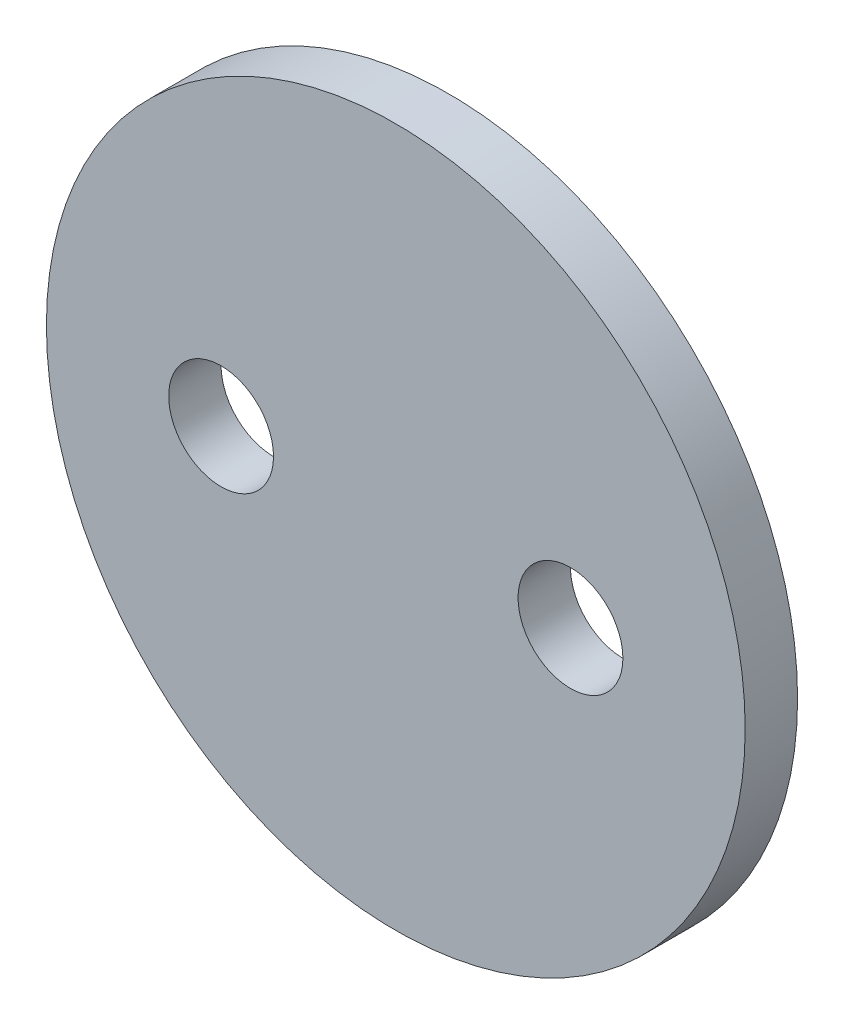
ISO-10303-21;
HEADER;
FILE_DESCRIPTION(('STEP AP214'),'2;1');
FILE_NAME('part.step','',(''),(''),'','','');
FILE_SCHEMA(('AUTOMOTIVE_DESIGN { 1 0 10303 214 1 1 1 1 }'));
ENDSEC;
DATA;
#1=APPLICATION_CONTEXT('core data for automotive mechanical design processes');
#2=APPLICATION_PROTOCOL_DEFINITION('international standard','automotive_design',2000,#1);
#3=PRODUCT_CONTEXT('',#1,'mechanical');
#4=PRODUCT('Part','Part','',(#3));
#5=PRODUCT_RELATED_PRODUCT_CATEGORY('part','',(#4));
#6=PRODUCT_DEFINITION_FORMATION('','',#4);
#7=PRODUCT_DEFINITION_CONTEXT('part definition',#1,'design');
#8=PRODUCT_DEFINITION('design','',#6,#7);
#9=PRODUCT_DEFINITION_SHAPE('','',#8);
#10=(LENGTH_UNIT() NAMED_UNIT(*) SI_UNIT(.MILLI.,.METRE.));
#11=(NAMED_UNIT(*) PLANE_ANGLE_UNIT() SI_UNIT($,.RADIAN.));
#12=(NAMED_UNIT(*) SI_UNIT($,.STERADIAN.) SOLID_ANGLE_UNIT());
#13=UNCERTAINTY_MEASURE_WITH_UNIT(LENGTH_MEASURE(1.E-05),#10,'distance_accuracy_value','');
#14=(GEOMETRIC_REPRESENTATION_CONTEXT(3) GLOBAL_UNCERTAINTY_ASSIGNED_CONTEXT((#13)) GLOBAL_UNIT_ASSIGNED_CONTEXT((#10,
#11,#12)) REPRESENTATION_CONTEXT('',''));
#15=CARTESIAN_POINT('',(0.,0.,0.));
#16=DIRECTION('',(0.,0.,1.));
#17=DIRECTION('',(1.,0.,0.));
#18=AXIS2_PLACEMENT_3D('',#15,#16,#17);
#19=CARTESIAN_POINT('',(0.,0.,1.5));
#20=DIRECTION('',(0.,0.,1.));
#21=DIRECTION('',(1.,0.,0.));
#22=AXIS2_PLACEMENT_3D('',#19,#20,#21);
#23=PLANE('',#22);
#24=CARTESIAN_POINT('',(-5.,0.,1.5));
#25=DIRECTION('',(0.,0.,1.));
#26=DIRECTION('',(1.,0.,0.));
#27=AXIS2_PLACEMENT_3D('',#24,#25,#26);
#28=CIRCLE('',#27,1.5);
#29=CARTESIAN_POINT('',(-3.5,0.,1.5));
#30=VERTEX_POINT('',#29);
#31=EDGE_CURVE('E50',#30,#30,#28,.T.);
#32=ORIENTED_EDGE('',*,*,#31,.F.);
#33=EDGE_LOOP('',(#32));
#34=FACE_BOUND('',#33,.T.);
#35=CARTESIAN_POINT('',(0.,0.,1.5));
#36=DIRECTION('',(0.,0.,1.));
#37=DIRECTION('',(1.,0.,0.));
#38=AXIS2_PLACEMENT_3D('',#35,#36,#37);
#39=CIRCLE('',#38,10.);
#40=CARTESIAN_POINT('',(10.,0.,1.5));
#41=VERTEX_POINT('',#40);
#42=EDGE_CURVE('E10',#41,#41,#39,.T.);
#43=ORIENTED_EDGE('',*,*,#42,.T.);
#44=EDGE_LOOP('',(#43));
#45=FACE_BOUND('',#44,.T.);
#46=CARTESIAN_POINT('',(5.,0.,1.5));
#47=DIRECTION('',(0.,0.,1.));
#48=DIRECTION('',(1.,0.,0.));
#49=AXIS2_PLACEMENT_3D('',#46,#47,#48);
#50=CIRCLE('',#49,1.5);
#51=CARTESIAN_POINT('',(6.5,0.,1.5));
#52=VERTEX_POINT('',#51);
#53=EDGE_CURVE('E56',#52,#52,#50,.T.);
#54=ORIENTED_EDGE('',*,*,#53,.F.);
#55=EDGE_LOOP('',(#54));
#56=FACE_BOUND('',#55,.T.);
#57=ADVANCED_FACE('F37',(#34,#45,#56),#23,.T.);
#58=CARTESIAN_POINT('',(0.,0.,0.));
#59=DIRECTION('',(0.,0.,1.));
#60=DIRECTION('',(1.,0.,0.));
#61=AXIS2_PLACEMENT_3D('',#58,#59,#60);
#62=PLANE('',#61);
#63=CARTESIAN_POINT('',(0.,0.,0.));
#64=DIRECTION('',(0.,0.,1.));
#65=DIRECTION('',(1.,0.,0.));
#66=AXIS2_PLACEMENT_3D('',#63,#64,#65);
#67=CIRCLE('',#66,10.);
#68=CARTESIAN_POINT('',(10.,0.,0.));
#69=VERTEX_POINT('',#68);
#70=EDGE_CURVE('E41',#69,#69,#67,.T.);
#71=ORIENTED_EDGE('',*,*,#70,.F.);
#72=EDGE_LOOP('',(#71));
#73=FACE_BOUND('',#72,.T.);
#74=CARTESIAN_POINT('',(-5.,0.,0.));
#75=DIRECTION('',(0.,0.,1.));
#76=DIRECTION('',(1.,0.,0.));
#77=AXIS2_PLACEMENT_3D('',#74,#75,#76);
#78=CIRCLE('',#77,1.5);
#79=CARTESIAN_POINT('',(-3.5,0.,0.));
#80=VERTEX_POINT('',#79);
#81=EDGE_CURVE('E52',#80,#80,#78,.T.);
#82=ORIENTED_EDGE('',*,*,#81,.T.);
#83=EDGE_LOOP('',(#82));
#84=FACE_BOUND('',#83,.T.);
#85=CARTESIAN_POINT('',(5.,0.,0.));
#86=DIRECTION('',(0.,0.,1.));
#87=DIRECTION('',(1.,0.,0.));
#88=AXIS2_PLACEMENT_3D('',#85,#86,#87);
#89=CIRCLE('',#88,1.5);
#90=CARTESIAN_POINT('',(6.5,0.,0.));
#91=VERTEX_POINT('',#90);
#92=EDGE_CURVE('E60',#91,#91,#89,.T.);
#93=ORIENTED_EDGE('',*,*,#92,.T.);
#94=EDGE_LOOP('',(#93));
#95=FACE_BOUND('',#94,.T.);
#96=ADVANCED_FACE('F72',(#73,#84,#95),#62,.F.);
#97=CARTESIAN_POINT('',(0.,0.,1.5));
#98=DIRECTION('',(0.,0.,-1.));
#99=DIRECTION('',(-1.,0.,0.));
#100=AXIS2_PLACEMENT_3D('',#97,#98,#99);
#101=CYLINDRICAL_SURFACE('',#100,10.);
#102=ORIENTED_EDGE('',*,*,#42,.F.);
#103=EDGE_LOOP('',(#102));
#104=FACE_BOUND('',#103,.T.);
#105=ORIENTED_EDGE('',*,*,#70,.T.);
#106=EDGE_LOOP('',(#105));
#107=FACE_BOUND('',#106,.T.);
#108=ADVANCED_FACE('F39',(#104,#107),#101,.T.);
#109=CARTESIAN_POINT('',(-5.,0.,1.5));
#110=DIRECTION('',(0.,0.,-1.));
#111=DIRECTION('',(-1.,0.,0.));
#112=AXIS2_PLACEMENT_3D('',#109,#110,#111);
#113=CYLINDRICAL_SURFACE('',#112,1.5);
#114=ORIENTED_EDGE('',*,*,#31,.T.);
#115=EDGE_LOOP('',(#114));
#116=FACE_BOUND('',#115,.T.);
#117=ORIENTED_EDGE('',*,*,#81,.F.);
#118=EDGE_LOOP('',(#117));
#119=FACE_BOUND('',#118,.T.);
#120=ADVANCED_FACE('F81',(#116,#119),#113,.F.);
#121=CARTESIAN_POINT('',(5.,0.,1.5));
#122=DIRECTION('',(0.,0.,-1.));
#123=DIRECTION('',(-1.,0.,0.));
#124=AXIS2_PLACEMENT_3D('',#121,#122,#123);
#125=CYLINDRICAL_SURFACE('',#124,1.5);
#126=ORIENTED_EDGE('',*,*,#53,.T.);
#127=EDGE_LOOP('',(#126));
#128=FACE_BOUND('',#127,.T.);
#129=ORIENTED_EDGE('',*,*,#92,.F.);
#130=EDGE_LOOP('',(#129));
#131=FACE_BOUND('',#130,.T.);
#132=ADVANCED_FACE('F68',(#128,#131),#125,.F.);
#133=CLOSED_SHELL('',(#57,#96,#108,#120,#132));
#134=MANIFOLD_SOLID_BREP('B2',#133);
#135=ADVANCED_BREP_SHAPE_REPRESENTATION('',(#18,#134),#14);
#136=SHAPE_DEFINITION_REPRESENTATION(#9,#135);
ENDSEC;
END-ISO-10303-21;
